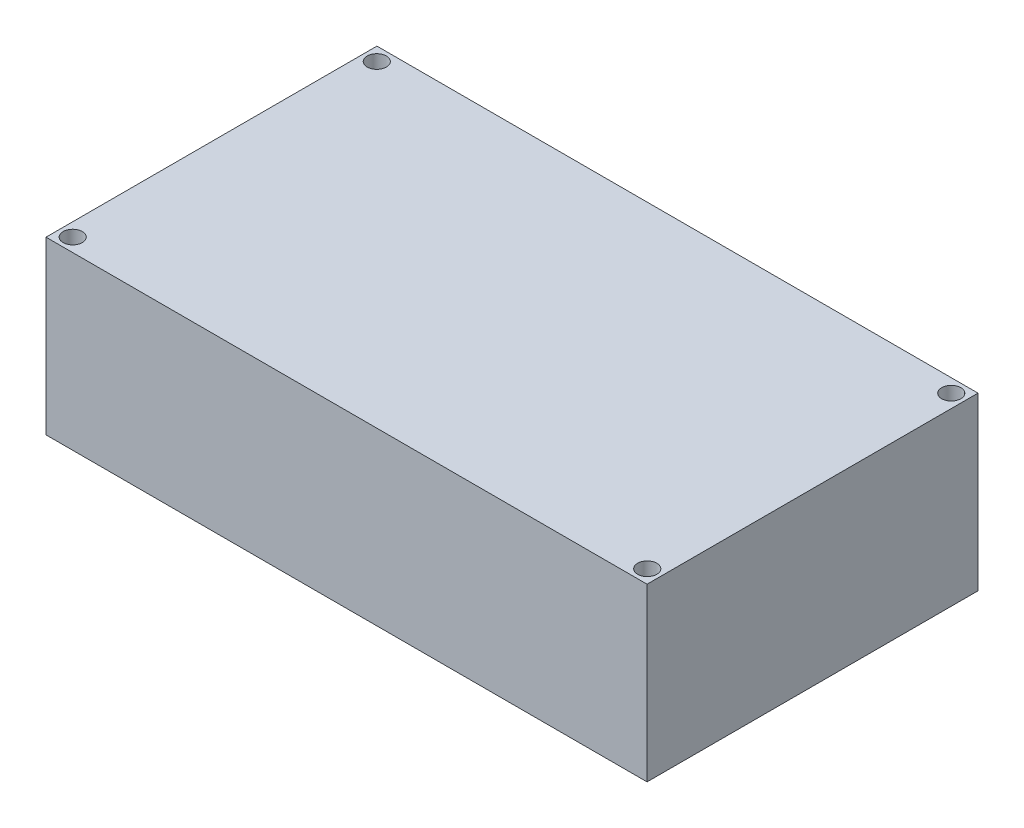
ISO-10303-21;
HEADER;
FILE_DESCRIPTION(('STEP AP214'),'2;1');
FILE_NAME('part.step','',(''),(''),'','','');
FILE_SCHEMA(('AUTOMOTIVE_DESIGN { 1 0 10303 214 1 1 1 1 }'));
ENDSEC;
DATA;
#1=APPLICATION_CONTEXT('core data for automotive mechanical design processes');
#2=APPLICATION_PROTOCOL_DEFINITION('international standard','automotive_design',2000,#1);
#3=PRODUCT_CONTEXT('',#1,'mechanical');
#4=PRODUCT('Part','Part','',(#3));
#5=PRODUCT_RELATED_PRODUCT_CATEGORY('part','',(#4));
#6=PRODUCT_DEFINITION_FORMATION('','',#4);
#7=PRODUCT_DEFINITION_CONTEXT('part definition',#1,'design');
#8=PRODUCT_DEFINITION('design','',#6,#7);
#9=PRODUCT_DEFINITION_SHAPE('','',#8);
#10=(LENGTH_UNIT() NAMED_UNIT(*) SI_UNIT(.MILLI.,.METRE.));
#11=(NAMED_UNIT(*) PLANE_ANGLE_UNIT() SI_UNIT($,.RADIAN.));
#12=(NAMED_UNIT(*) SI_UNIT($,.STERADIAN.) SOLID_ANGLE_UNIT());
#13=UNCERTAINTY_MEASURE_WITH_UNIT(LENGTH_MEASURE(1.E-05),#10,'distance_accuracy_value','');
#14=(GEOMETRIC_REPRESENTATION_CONTEXT(3) GLOBAL_UNCERTAINTY_ASSIGNED_CONTEXT((#13)) GLOBAL_UNIT_ASSIGNED_CONTEXT((#10,
#11,#12)) REPRESENTATION_CONTEXT('',''));
#15=CARTESIAN_POINT('',(0.,0.,0.));
#16=DIRECTION('',(0.,0.,1.));
#17=DIRECTION('',(1.,0.,0.));
#18=AXIS2_PLACEMENT_3D('',#15,#16,#17);
#19=CARTESIAN_POINT('',(-93.9,53.5,51.7));
#20=DIRECTION('',(1.,0.,0.));
#21=DIRECTION('',(0.,0.,-1.));
#22=AXIS2_PLACEMENT_3D('',#19,#20,#21);
#23=PLANE('',#22);
#24=DIRECTION('',(0.,0.,1.));
#25=VECTOR('',#24,1.);
#26=CARTESIAN_POINT('',(-93.9,0.,51.7));
#27=LINE('',#26,#25);
#28=CARTESIAN_POINT('',(-93.9,0.,-51.7));
#29=VERTEX_POINT('',#28);
#30=CARTESIAN_POINT('',(-93.9,0.,51.7));
#31=VERTEX_POINT('',#30);
#32=EDGE_CURVE('E98',#29,#31,#27,.T.);
#33=ORIENTED_EDGE('',*,*,#32,.T.);
#34=DIRECTION('',(0.,-1.,0.));
#35=VECTOR('',#34,1.);
#36=CARTESIAN_POINT('',(-93.9,53.5,51.7));
#37=LINE('',#36,#35);
#38=CARTESIAN_POINT('',(-93.9,53.5,51.7));
#39=VERTEX_POINT('',#38);
#40=EDGE_CURVE('E11',#39,#31,#37,.T.);
#41=ORIENTED_EDGE('',*,*,#40,.F.);
#42=DIRECTION('',(0.,0.,1.));
#43=VECTOR('',#42,1.);
#44=CARTESIAN_POINT('',(-93.9,53.5,51.7));
#45=LINE('',#44,#43);
#46=CARTESIAN_POINT('',(-93.9,53.5,-51.7));
#47=VERTEX_POINT('',#46);
#48=EDGE_CURVE('E86',#47,#39,#45,.T.);
#49=ORIENTED_EDGE('',*,*,#48,.F.);
#50=DIRECTION('',(0.,-1.,0.));
#51=VECTOR('',#50,1.);
#52=CARTESIAN_POINT('',(-93.9,53.5,-51.7));
#53=LINE('',#52,#51);
#54=EDGE_CURVE('E94',#47,#29,#53,.T.);
#55=ORIENTED_EDGE('',*,*,#54,.T.);
#56=EDGE_LOOP('',(#33,#41,#49,#55));
#57=FACE_BOUND('',#56,.T.);
#58=ADVANCED_FACE('F35',(#57),#23,.F.);
#59=CARTESIAN_POINT('',(93.9,53.5,51.7));
#60=DIRECTION('',(0.,0.,-1.));
#61=DIRECTION('',(-1.,0.,0.));
#62=AXIS2_PLACEMENT_3D('',#59,#60,#61);
#63=PLANE('',#62);
#64=DIRECTION('',(1.,0.,0.));
#65=VECTOR('',#64,1.);
#66=CARTESIAN_POINT('',(93.9,0.,51.7));
#67=LINE('',#66,#65);
#68=CARTESIAN_POINT('',(93.9,0.,51.7));
#69=VERTEX_POINT('',#68);
#70=EDGE_CURVE('E90',#31,#69,#67,.T.);
#71=ORIENTED_EDGE('',*,*,#70,.T.);
#72=DIRECTION('',(0.,-1.,0.));
#73=VECTOR('',#72,1.);
#74=CARTESIAN_POINT('',(93.9,53.5,51.7));
#75=LINE('',#74,#73);
#76=CARTESIAN_POINT('',(93.9,53.5,51.7));
#77=VERTEX_POINT('',#76);
#78=EDGE_CURVE('E43',#77,#69,#75,.T.);
#79=ORIENTED_EDGE('',*,*,#78,.F.);
#80=DIRECTION('',(1.,0.,0.));
#81=VECTOR('',#80,1.);
#82=CARTESIAN_POINT('',(93.9,53.5,51.7));
#83=LINE('',#82,#81);
#84=EDGE_CURVE('E81',#39,#77,#83,.T.);
#85=ORIENTED_EDGE('',*,*,#84,.F.);
#86=ORIENTED_EDGE('',*,*,#40,.T.);
#87=EDGE_LOOP('',(#71,#79,#85,#86));
#88=FACE_BOUND('',#87,.T.);
#89=ADVANCED_FACE('F89',(#88),#63,.F.);
#90=CARTESIAN_POINT('',(93.9,53.5,51.7));
#91=DIRECTION('',(-1.,0.,0.));
#92=DIRECTION('',(0.,0.,1.));
#93=AXIS2_PLACEMENT_3D('',#90,#91,#92);
#94=PLANE('',#93);
#95=DIRECTION('',(0.,0.,-1.));
#96=VECTOR('',#95,1.);
#97=CARTESIAN_POINT('',(93.9,0.,51.7));
#98=LINE('',#97,#96);
#99=CARTESIAN_POINT('',(93.9,0.,-51.7));
#100=VERTEX_POINT('',#99);
#101=EDGE_CURVE('E68',#69,#100,#98,.T.);
#102=ORIENTED_EDGE('',*,*,#101,.T.);
#103=DIRECTION('',(0.,-1.,0.));
#104=VECTOR('',#103,1.);
#105=CARTESIAN_POINT('',(93.9,53.5,-51.7));
#106=LINE('',#105,#104);
#107=CARTESIAN_POINT('',(93.9,53.5,-51.7));
#108=VERTEX_POINT('',#107);
#109=EDGE_CURVE('E91',#108,#100,#106,.T.);
#110=ORIENTED_EDGE('',*,*,#109,.F.);
#111=DIRECTION('',(0.,0.,-1.));
#112=VECTOR('',#111,1.);
#113=CARTESIAN_POINT('',(93.9,53.5,51.7));
#114=LINE('',#113,#112);
#115=EDGE_CURVE('E84',#77,#108,#114,.T.);
#116=ORIENTED_EDGE('',*,*,#115,.F.);
#117=ORIENTED_EDGE('',*,*,#78,.T.);
#118=EDGE_LOOP('',(#102,#110,#116,#117));
#119=FACE_BOUND('',#118,.T.);
#120=ADVANCED_FACE('F92',(#119),#94,.F.);
#121=CARTESIAN_POINT('',(93.9,53.5,-51.7));
#122=DIRECTION('',(0.,0.,1.));
#123=DIRECTION('',(1.,0.,0.));
#124=AXIS2_PLACEMENT_3D('',#121,#122,#123);
#125=PLANE('',#124);
#126=DIRECTION('',(-1.,0.,0.));
#127=VECTOR('',#126,1.);
#128=CARTESIAN_POINT('',(93.9,0.,-51.7));
#129=LINE('',#128,#127);
#130=EDGE_CURVE('E74',#100,#29,#129,.T.);
#131=ORIENTED_EDGE('',*,*,#130,.T.);
#132=ORIENTED_EDGE('',*,*,#54,.F.);
#133=DIRECTION('',(-1.,0.,0.));
#134=VECTOR('',#133,1.);
#135=CARTESIAN_POINT('',(93.9,53.5,-51.7));
#136=LINE('',#135,#134);
#137=EDGE_CURVE('E51',#108,#47,#136,.T.);
#138=ORIENTED_EDGE('',*,*,#137,.F.);
#139=ORIENTED_EDGE('',*,*,#109,.T.);
#140=EDGE_LOOP('',(#131,#132,#138,#139));
#141=FACE_BOUND('',#140,.T.);
#142=ADVANCED_FACE('F106',(#141),#125,.F.);
#143=CARTESIAN_POINT('',(0.,53.5,0.));
#144=DIRECTION('',(0.,1.,0.));
#145=DIRECTION('',(0.,0.,1.));
#146=AXIS2_PLACEMENT_3D('',#143,#144,#145);
#147=PLANE('',#146);
#148=CARTESIAN_POINT('',(89.75,53.5,-47.5));
#149=DIRECTION('',(0.,1.,0.));
#150=DIRECTION('',(0.,0.,-1.));
#151=AXIS2_PLACEMENT_3D('',#148,#149,#150);
#152=CIRCLE('',#151,3.00000000000001);
#153=CARTESIAN_POINT('',(89.75,53.5,-50.5));
#154=VERTEX_POINT('',#153);
#155=EDGE_CURVE('E130',#154,#154,#152,.T.);
#156=ORIENTED_EDGE('',*,*,#155,.F.);
#157=EDGE_LOOP('',(#156));
#158=FACE_BOUND('',#157,.T.);
#159=CARTESIAN_POINT('',(89.75,53.5,47.5));
#160=DIRECTION('',(0.,1.,0.));
#161=DIRECTION('',(0.,0.,1.));
#162=AXIS2_PLACEMENT_3D('',#159,#160,#161);
#163=CIRCLE('',#162,3.00000000000001);
#164=CARTESIAN_POINT('',(89.75,53.5,50.5));
#165=VERTEX_POINT('',#164);
#166=EDGE_CURVE('E124',#165,#165,#163,.T.);
#167=ORIENTED_EDGE('',*,*,#166,.F.);
#168=EDGE_LOOP('',(#167));
#169=FACE_BOUND('',#168,.T.);
#170=CARTESIAN_POINT('',(-89.75,53.5,47.5));
#171=DIRECTION('',(0.,1.,0.));
#172=DIRECTION('',(0.,0.,-1.));
#173=AXIS2_PLACEMENT_3D('',#170,#171,#172);
#174=CIRCLE('',#173,3.00000000000001);
#175=CARTESIAN_POINT('',(-89.75,53.5,44.5));
#176=VERTEX_POINT('',#175);
#177=EDGE_CURVE('E118',#176,#176,#174,.T.);
#178=ORIENTED_EDGE('',*,*,#177,.F.);
#179=EDGE_LOOP('',(#178));
#180=FACE_BOUND('',#179,.T.);
#181=CARTESIAN_POINT('',(-89.75,53.5,-47.5));
#182=DIRECTION('',(0.,1.,0.));
#183=DIRECTION('',(0.,0.,1.));
#184=AXIS2_PLACEMENT_3D('',#181,#182,#183);
#185=CIRCLE('',#184,3.00000000000001);
#186=CARTESIAN_POINT('',(-89.75,53.5,-44.5));
#187=VERTEX_POINT('',#186);
#188=EDGE_CURVE('E112',#187,#187,#185,.T.);
#189=ORIENTED_EDGE('',*,*,#188,.F.);
#190=EDGE_LOOP('',(#189));
#191=FACE_BOUND('',#190,.T.);
#192=ORIENTED_EDGE('',*,*,#48,.T.);
#193=ORIENTED_EDGE('',*,*,#84,.T.);
#194=ORIENTED_EDGE('',*,*,#115,.T.);
#195=ORIENTED_EDGE('',*,*,#137,.T.);
#196=EDGE_LOOP('',(#192,#193,#194,#195));
#197=FACE_BOUND('',#196,.T.);
#198=ADVANCED_FACE('F82',(#158,#169,#180,#191,#197),#147,.T.);
#199=CARTESIAN_POINT('',(0.,0.,0.));
#200=DIRECTION('',(0.,1.,0.));
#201=DIRECTION('',(0.,0.,1.));
#202=AXIS2_PLACEMENT_3D('',#199,#200,#201);
#203=PLANE('',#202);
#204=CARTESIAN_POINT('',(89.75,0.,-47.5));
#205=DIRECTION('',(0.,1.,0.));
#206=DIRECTION('',(0.,0.,-1.));
#207=AXIS2_PLACEMENT_3D('',#204,#205,#206);
#208=CIRCLE('',#207,3.00000000000001);
#209=CARTESIAN_POINT('',(89.75,0.,-50.5));
#210=VERTEX_POINT('',#209);
#211=EDGE_CURVE('E115',#210,#210,#208,.T.);
#212=ORIENTED_EDGE('',*,*,#211,.T.);
#213=EDGE_LOOP('',(#212));
#214=FACE_BOUND('',#213,.T.);
#215=CARTESIAN_POINT('',(89.75,0.,47.5));
#216=DIRECTION('',(0.,1.,0.));
#217=DIRECTION('',(0.,0.,1.));
#218=AXIS2_PLACEMENT_3D('',#215,#216,#217);
#219=CIRCLE('',#218,3.00000000000001);
#220=CARTESIAN_POINT('',(89.75,0.,50.5));
#221=VERTEX_POINT('',#220);
#222=EDGE_CURVE('E127',#221,#221,#219,.T.);
#223=ORIENTED_EDGE('',*,*,#222,.T.);
#224=EDGE_LOOP('',(#223));
#225=FACE_BOUND('',#224,.T.);
#226=CARTESIAN_POINT('',(-89.75,0.,47.5));
#227=DIRECTION('',(0.,1.,0.));
#228=DIRECTION('',(0.,0.,-1.));
#229=AXIS2_PLACEMENT_3D('',#226,#227,#228);
#230=CIRCLE('',#229,3.00000000000001);
#231=CARTESIAN_POINT('',(-89.75,0.,44.5));
#232=VERTEX_POINT('',#231);
#233=EDGE_CURVE('E121',#232,#232,#230,.T.);
#234=ORIENTED_EDGE('',*,*,#233,.T.);
#235=EDGE_LOOP('',(#234));
#236=FACE_BOUND('',#235,.T.);
#237=CARTESIAN_POINT('',(-89.75,0.,-47.5));
#238=DIRECTION('',(0.,1.,0.));
#239=DIRECTION('',(0.,0.,1.));
#240=AXIS2_PLACEMENT_3D('',#237,#238,#239);
#241=CIRCLE('',#240,3.00000000000001);
#242=CARTESIAN_POINT('',(-89.75,0.,-44.5));
#243=VERTEX_POINT('',#242);
#244=EDGE_CURVE('E101',#243,#243,#241,.T.);
#245=ORIENTED_EDGE('',*,*,#244,.T.);
#246=EDGE_LOOP('',(#245));
#247=FACE_BOUND('',#246,.T.);
#248=ORIENTED_EDGE('',*,*,#32,.F.);
#249=ORIENTED_EDGE('',*,*,#130,.F.);
#250=ORIENTED_EDGE('',*,*,#101,.F.);
#251=ORIENTED_EDGE('',*,*,#70,.F.);
#252=EDGE_LOOP('',(#248,#249,#250,#251));
#253=FACE_BOUND('',#252,.T.);
#254=ADVANCED_FACE('F109',(#214,#225,#236,#247,#253),#203,.F.);
#255=CARTESIAN_POINT('',(-89.75,0.,-47.5));
#256=DIRECTION('',(0.,1.,0.));
#257=DIRECTION('',(0.,0.,1.));
#258=AXIS2_PLACEMENT_3D('',#255,#256,#257);
#259=CYLINDRICAL_SURFACE('',#258,3.00000000000001);
#260=ORIENTED_EDGE('',*,*,#244,.F.);
#261=EDGE_LOOP('',(#260));
#262=FACE_BOUND('',#261,.T.);
#263=ORIENTED_EDGE('',*,*,#188,.T.);
#264=EDGE_LOOP('',(#263));
#265=FACE_BOUND('',#264,.T.);
#266=ADVANCED_FACE('F154',(#262,#265),#259,.F.);
#267=CARTESIAN_POINT('',(-89.75,0.,47.5));
#268=DIRECTION('',(0.,1.,0.));
#269=DIRECTION('',(0.,0.,1.));
#270=AXIS2_PLACEMENT_3D('',#267,#268,#269);
#271=CYLINDRICAL_SURFACE('',#270,3.00000000000001);
#272=ORIENTED_EDGE('',*,*,#233,.F.);
#273=EDGE_LOOP('',(#272));
#274=FACE_BOUND('',#273,.T.);
#275=ORIENTED_EDGE('',*,*,#177,.T.);
#276=EDGE_LOOP('',(#275));
#277=FACE_BOUND('',#276,.T.);
#278=ADVANCED_FACE('F156',(#274,#277),#271,.F.);
#279=CARTESIAN_POINT('',(89.75,0.,47.5));
#280=DIRECTION('',(0.,1.,0.));
#281=DIRECTION('',(0.,0.,1.));
#282=AXIS2_PLACEMENT_3D('',#279,#280,#281);
#283=CYLINDRICAL_SURFACE('',#282,3.00000000000001);
#284=ORIENTED_EDGE('',*,*,#222,.F.);
#285=EDGE_LOOP('',(#284));
#286=FACE_BOUND('',#285,.T.);
#287=ORIENTED_EDGE('',*,*,#166,.T.);
#288=EDGE_LOOP('',(#287));
#289=FACE_BOUND('',#288,.T.);
#290=ADVANCED_FACE('F141',(#286,#289),#283,.F.);
#291=CARTESIAN_POINT('',(89.75,0.,-47.5));
#292=DIRECTION('',(0.,1.,0.));
#293=DIRECTION('',(0.,0.,1.));
#294=AXIS2_PLACEMENT_3D('',#291,#292,#293);
#295=CYLINDRICAL_SURFACE('',#294,3.00000000000001);
#296=ORIENTED_EDGE('',*,*,#211,.F.);
#297=EDGE_LOOP('',(#296));
#298=FACE_BOUND('',#297,.T.);
#299=ORIENTED_EDGE('',*,*,#155,.T.);
#300=EDGE_LOOP('',(#299));
#301=FACE_BOUND('',#300,.T.);
#302=ADVANCED_FACE('F138',(#298,#301),#295,.F.);
#303=CLOSED_SHELL('',(#58,#89,#120,#142,#198,#254,#266,#278,#290,#302));
#304=MANIFOLD_SOLID_BREP('B2',#303);
#305=ADVANCED_BREP_SHAPE_REPRESENTATION('',(#18,#304),#14);
#306=SHAPE_DEFINITION_REPRESENTATION(#9,#305);
ENDSEC;
END-ISO-10303-21;
